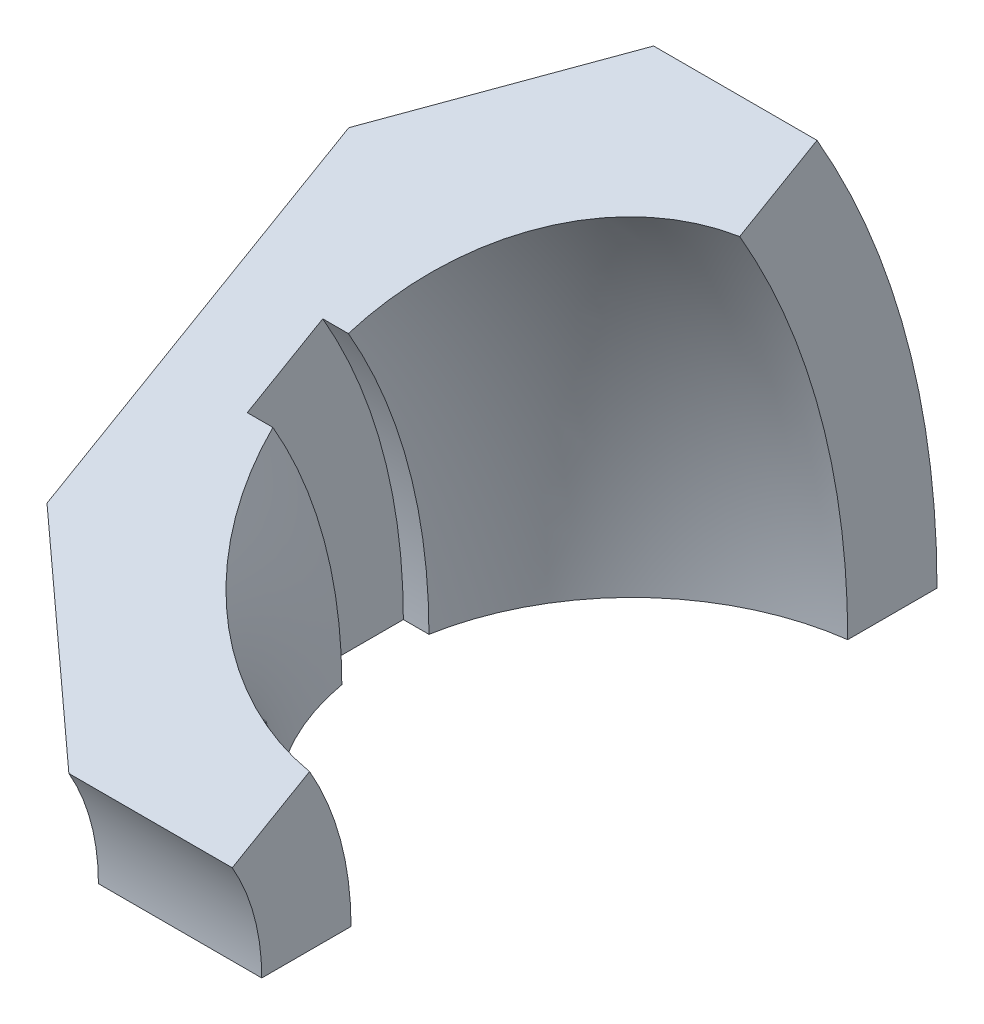
ISO-10303-21;
HEADER;
FILE_DESCRIPTION(('STEP AP214'),'2;1');
FILE_NAME('part.step','',(''),(''),'','','');
FILE_SCHEMA(('AUTOMOTIVE_DESIGN { 1 0 10303 214 1 1 1 1 }'));
ENDSEC;
DATA;
#1=APPLICATION_CONTEXT('core data for automotive mechanical design processes');
#2=APPLICATION_PROTOCOL_DEFINITION('international standard','automotive_design',2000,#1);
#3=PRODUCT_CONTEXT('',#1,'mechanical');
#4=PRODUCT('Part','Part','',(#3));
#5=PRODUCT_RELATED_PRODUCT_CATEGORY('part','',(#4));
#6=PRODUCT_DEFINITION_FORMATION('','',#4);
#7=PRODUCT_DEFINITION_CONTEXT('part definition',#1,'design');
#8=PRODUCT_DEFINITION('design','',#6,#7);
#9=PRODUCT_DEFINITION_SHAPE('','',#8);
#10=(LENGTH_UNIT() NAMED_UNIT(*) SI_UNIT(.MILLI.,.METRE.));
#11=(NAMED_UNIT(*) PLANE_ANGLE_UNIT() SI_UNIT($,.RADIAN.));
#12=(NAMED_UNIT(*) SI_UNIT($,.STERADIAN.) SOLID_ANGLE_UNIT());
#13=UNCERTAINTY_MEASURE_WITH_UNIT(LENGTH_MEASURE(1.E-05),#10,'distance_accuracy_value','');
#14=(GEOMETRIC_REPRESENTATION_CONTEXT(3) GLOBAL_UNCERTAINTY_ASSIGNED_CONTEXT((#13)) GLOBAL_UNIT_ASSIGNED_CONTEXT((#10,
#11,#12)) REPRESENTATION_CONTEXT('',''));
#15=CARTESIAN_POINT('',(0.,0.,0.));
#16=DIRECTION('',(0.,0.,1.));
#17=DIRECTION('',(1.,0.,0.));
#18=AXIS2_PLACEMENT_3D('',#15,#16,#17);
#19=CARTESIAN_POINT('',(0.,25.6217782649108,6.86533479473208));
#20=DIRECTION('',(0.,-0.866025403784447,-0.499999999999986));
#21=DIRECTION('',(0.,0.499999999999986,-0.866025403784447));
#22=AXIS2_PLACEMENT_3D('',#19,#20,#21);
#23=PLANE('',#22);
#24=DIRECTION('',(-1.,0.,0.));
#25=VECTOR('',#24,1.);
#26=CARTESIAN_POINT('',(-33.,10.1217782649112,33.71212231205));
#27=LINE('',#26,#25);
#28=CARTESIAN_POINT('',(-3.00000000000001,10.1217782649112,33.71212231205));
#29=VERTEX_POINT('',#28);
#30=CARTESIAN_POINT('',(-18.,10.1217782649112,33.71212231205));
#31=VERTEX_POINT('',#30);
#32=EDGE_CURVE('E189',#29,#31,#27,.T.);
#33=ORIENTED_EDGE('',*,*,#32,.F.);
#34=DIRECTION('',(0.,-0.499999999999986,0.866025403784447));
#35=VECTOR('',#34,1.);
#36=CARTESIAN_POINT('',(-3.00000000000001,10.1217782649112,33.71212231205));
#37=LINE('',#36,#35);
#38=CARTESIAN_POINT('',(-3.00000000000001,14.2200240139197,26.6137524528638));
#39=VERTEX_POINT('',#38);
#40=EDGE_CURVE('E181',#39,#29,#37,.T.);
#41=ORIENTED_EDGE('',*,*,#40,.F.);
#42=CARTESIAN_POINT('',(0.,25.6217782649108,6.86533479473208));
#43=DIRECTION('',(0.,0.866025403784447,0.499999999999986));
#44=DIRECTION('',(0.,0.499999999999986,-0.866025403784447));
#45=AXIS2_PLACEMENT_3D('',#42,#43,#44);
#46=CIRCLE('',#45,23.0000000000001);
#47=CARTESIAN_POINT('',(-22.6495033058122,23.6217782649108,10.3294364098699));
#48=VERTEX_POINT('',#47);
#49=EDGE_CURVE('E173',#48,#39,#46,.T.);
#50=ORIENTED_EDGE('',*,*,#49,.F.);
#51=DIRECTION('',(1.,0.,0.));
#52=VECTOR('',#51,1.);
#53=CARTESIAN_POINT('',(-22.6495033058122,23.6217782649108,10.3294364098699));
#54=LINE('',#53,#52);
#55=CARTESIAN_POINT('',(-25.,23.6217782649108,10.3294364098699));
#56=VERTEX_POINT('',#55);
#57=EDGE_CURVE('E165',#56,#48,#54,.T.);
#58=ORIENTED_EDGE('',*,*,#57,.F.);
#59=DIRECTION('',(0.,-0.499999999999986,0.866025403784447));
#60=VECTOR('',#59,1.);
#61=CARTESIAN_POINT('',(-25.,27.6217782649107,3.40123317959437));
#62=LINE('',#61,#60);
#63=CARTESIAN_POINT('',(-25.,27.6217782649107,3.40123317959437));
#64=VERTEX_POINT('',#63);
#65=EDGE_CURVE('E151',#64,#56,#62,.T.);
#66=ORIENTED_EDGE('',*,*,#65,.F.);
#67=DIRECTION('',(-1.,0.,0.));
#68=VECTOR('',#67,1.);
#69=CARTESIAN_POINT('',(-25.,27.6217782649107,3.40123317959437));
#70=LINE('',#69,#68);
#71=CARTESIAN_POINT('',(-22.6495033058122,27.6217782649107,3.40123317959437));
#72=VERTEX_POINT('',#71);
#73=EDGE_CURVE('E149',#72,#64,#70,.T.);
#74=ORIENTED_EDGE('',*,*,#73,.F.);
#75=CARTESIAN_POINT('',(0.,25.6217782649108,6.86533479473216));
#76=DIRECTION('',(0.,0.866025403784447,0.499999999999986));
#77=DIRECTION('',(0.,0.499999999999986,-0.866025403784447));
#78=AXIS2_PLACEMENT_3D('',#75,#76,#77);
#79=CIRCLE('',#78,23.);
#80=CARTESIAN_POINT('',(-3.00000000000001,37.0235325159018,-12.8830828633995));
#81=VERTEX_POINT('',#80);
#82=EDGE_CURVE('E130',#81,#72,#79,.T.);
#83=ORIENTED_EDGE('',*,*,#82,.F.);
#84=DIRECTION('',(0.,-0.499999999999986,0.866025403784447));
#85=VECTOR('',#84,1.);
#86=CARTESIAN_POINT('',(-3.00000000000001,37.0235325159018,-12.8830828633995));
#87=LINE('',#86,#85);
#88=CARTESIAN_POINT('',(-3.,41.1217782649103,-19.9814527225857));
#89=VERTEX_POINT('',#88);
#90=EDGE_CURVE('E137',#89,#81,#87,.T.);
#91=ORIENTED_EDGE('',*,*,#90,.F.);
#92=DIRECTION('',(1.,0.,0.));
#93=VECTOR('',#92,1.);
#94=CARTESIAN_POINT('',(-3.,41.1217782649103,-19.9814527225857));
#95=LINE('',#94,#93);
#96=CARTESIAN_POINT('',(-18.,41.1217782649103,-19.9814527225857));
#97=VERTEX_POINT('',#96);
#98=EDGE_CURVE('E144',#97,#89,#95,.T.);
#99=ORIENTED_EDGE('',*,*,#98,.F.);
#100=DIRECTION('',(-0.707106781186546,-0.353553390593265,0.612372435695802));
#101=VECTOR('',#100,1.);
#102=CARTESIAN_POINT('',(-100.243556529823,0.,51.2435565298233));
#103=LINE('',#102,#101);
#104=CARTESIAN_POINT('',(-33.,33.6217782649105,-6.99107166581893));
#105=VERTEX_POINT('',#104);
#106=EDGE_CURVE('E222',#105,#97,#103,.F.);
#107=ORIENTED_EDGE('',*,*,#106,.F.);
#108=DIRECTION('',(0.,0.499999999999986,-0.866025403784447));
#109=VECTOR('',#108,1.);
#110=CARTESIAN_POINT('',(-33.,41.1217782649103,-19.9814527225857));
#111=LINE('',#110,#109);
#112=CARTESIAN_POINT('',(-33.,17.621778264911,20.7217412552833));
#113=VERTEX_POINT('',#112);
#114=EDGE_CURVE('E197',#113,#105,#111,.T.);
#115=ORIENTED_EDGE('',*,*,#114,.F.);
#116=DIRECTION('',(-0.707106781186549,0.353553390593264,-0.612372435695799));
#117=VECTOR('',#116,1.);
#118=CARTESIAN_POINT('',(2.24355652982317,0.,51.2435565298233));
#119=LINE('',#118,#117);
#120=EDGE_CURVE('E45',#31,#113,#119,.T.);
#121=ORIENTED_EDGE('',*,*,#120,.F.);
#122=EDGE_LOOP('',(#33,#41,#50,#58,#66,#74,#83,#91,#99,#107,#115,#121));
#123=FACE_BOUND('',#122,.T.);
#124=ADVANCED_FACE('F37',(#123),#23,.F.);
#125=CARTESIAN_POINT('',(0.,0.,0.));
#126=DIRECTION('',(0.,-1.,0.));
#127=DIRECTION('',(0.,0.,-1.));
#128=AXIS2_PLACEMENT_3D('',#125,#126,#127);
#129=PLANE('',#128);
#130=DIRECTION('',(0.,0.,-1.));
#131=VECTOR('',#130,1.);
#132=CARTESIAN_POINT('',(-33.,0.,-31.));
#133=LINE('',#132,#131);
#134=CARTESIAN_POINT('',(-33.,0.,16.));
#135=VERTEX_POINT('',#134);
#136=CARTESIAN_POINT('',(-33.,0.,-15.9999999999999));
#137=VERTEX_POINT('',#136);
#138=EDGE_CURVE('E200',#135,#137,#133,.T.);
#139=ORIENTED_EDGE('',*,*,#138,.T.);
#140=DIRECTION('',(-0.707106781186546,0.,0.707106781186549));
#141=VECTOR('',#140,1.);
#142=CARTESIAN_POINT('',(-100.243556529823,0.,51.2435565298231));
#143=LINE('',#142,#141);
#144=CARTESIAN_POINT('',(-18.,0.,-31.));
#145=VERTEX_POINT('',#144);
#146=EDGE_CURVE('E216',#145,#137,#143,.T.);
#147=ORIENTED_EDGE('',*,*,#146,.F.);
#148=DIRECTION('',(1.,0.,0.));
#149=VECTOR('',#148,1.);
#150=CARTESIAN_POINT('',(-3.,0.,-31.));
#151=LINE('',#150,#149);
#152=CARTESIAN_POINT('',(-3.,0.,-31.));
#153=VERTEX_POINT('',#152);
#154=EDGE_CURVE('E205',#145,#153,#151,.T.);
#155=ORIENTED_EDGE('',*,*,#154,.T.);
#156=DIRECTION('',(0.,0.,1.));
#157=VECTOR('',#156,1.);
#158=CARTESIAN_POINT('',(-3.00000000000001,0.,-22.8035085019828));
#159=LINE('',#158,#157);
#160=CARTESIAN_POINT('',(-3.00000000000001,0.,-22.8035085019828));
#161=VERTEX_POINT('',#160);
#162=EDGE_CURVE('E209',#153,#161,#159,.T.);
#163=ORIENTED_EDGE('',*,*,#162,.T.);
#164=CARTESIAN_POINT('',(0.,0.,0.));
#165=DIRECTION('',(0.,1.,0.));
#166=DIRECTION('',(0.,0.,-1.));
#167=AXIS2_PLACEMENT_3D('',#164,#165,#166);
#168=CIRCLE('',#167,23.);
#169=CARTESIAN_POINT('',(-22.6495033058122,0.,-4.));
#170=VERTEX_POINT('',#169);
#171=EDGE_CURVE('E133',#161,#170,#168,.T.);
#172=ORIENTED_EDGE('',*,*,#171,.T.);
#173=DIRECTION('',(-1.,0.,0.));
#174=VECTOR('',#173,1.);
#175=CARTESIAN_POINT('',(-25.,0.,-4.));
#176=LINE('',#175,#174);
#177=CARTESIAN_POINT('',(-25.,0.,-4.));
#178=VERTEX_POINT('',#177);
#179=EDGE_CURVE('E156',#170,#178,#176,.T.);
#180=ORIENTED_EDGE('',*,*,#179,.T.);
#181=DIRECTION('',(0.,0.,1.));
#182=VECTOR('',#181,1.);
#183=CARTESIAN_POINT('',(-25.,0.,-4.));
#184=LINE('',#183,#182);
#185=CARTESIAN_POINT('',(-25.,0.,4.));
#186=VERTEX_POINT('',#185);
#187=EDGE_CURVE('E162',#178,#186,#184,.T.);
#188=ORIENTED_EDGE('',*,*,#187,.T.);
#189=DIRECTION('',(1.,0.,0.));
#190=VECTOR('',#189,1.);
#191=CARTESIAN_POINT('',(-22.6495033058122,0.,4.));
#192=LINE('',#191,#190);
#193=CARTESIAN_POINT('',(-22.6495033058122,0.,4.));
#194=VERTEX_POINT('',#193);
#195=EDGE_CURVE('E170',#186,#194,#192,.T.);
#196=ORIENTED_EDGE('',*,*,#195,.T.);
#197=CARTESIAN_POINT('',(0.,0.,0.));
#198=DIRECTION('',(0.,1.,0.));
#199=DIRECTION('',(0.,0.,-1.));
#200=AXIS2_PLACEMENT_3D('',#197,#198,#199);
#201=CIRCLE('',#200,23.0000000000001);
#202=CARTESIAN_POINT('',(-3.00000000000001,0.,22.8035085019828));
#203=VERTEX_POINT('',#202);
#204=EDGE_CURVE('E178',#194,#203,#201,.T.);
#205=ORIENTED_EDGE('',*,*,#204,.T.);
#206=DIRECTION('',(0.,0.,1.));
#207=VECTOR('',#206,1.);
#208=CARTESIAN_POINT('',(-3.00000000000001,0.,31.));
#209=LINE('',#208,#207);
#210=CARTESIAN_POINT('',(-3.00000000000001,0.,31.));
#211=VERTEX_POINT('',#210);
#212=EDGE_CURVE('E186',#203,#211,#209,.T.);
#213=ORIENTED_EDGE('',*,*,#212,.T.);
#214=DIRECTION('',(-1.,0.,0.));
#215=VECTOR('',#214,1.);
#216=CARTESIAN_POINT('',(-33.,0.,31.));
#217=LINE('',#216,#215);
#218=CARTESIAN_POINT('',(-18.,0.,31.));
#219=VERTEX_POINT('',#218);
#220=EDGE_CURVE('E194',#211,#219,#217,.T.);
#221=ORIENTED_EDGE('',*,*,#220,.T.);
#222=DIRECTION('',(-0.707106781186549,0.,-0.707106781186546));
#223=VECTOR('',#222,1.);
#224=CARTESIAN_POINT('',(2.24355652982317,0.,51.2435565298231));
#225=LINE('',#224,#223);
#226=EDGE_CURVE('E219',#135,#219,#225,.F.);
#227=ORIENTED_EDGE('',*,*,#226,.F.);
#228=EDGE_LOOP('',(#139,#147,#155,#163,#172,#180,#188,#196,#205,#213,#221,#227));
#229=FACE_BOUND('',#228,.T.);
#230=ADVANCED_FACE('F232',(#229),#129,.T.);
#231=CARTESIAN_POINT('',(0.,-4.5102810375397E-13,51.2435565298231));
#232=DIRECTION('',(1.,0.,0.));
#233=DIRECTION('',(0.,0.,1.));
#234=AXIS2_PLACEMENT_3D('',#231,#232,#233);
#235=TOROIDAL_SURFACE('',#234,51.2435565298231,23.);
#236=CARTESIAN_POINT('',(-22.6495033058122,-4.5102810375397E-13,51.2435565298231));
#237=DIRECTION('',(-1.,0.,0.));
#238=DIRECTION('',(0.,0.499999999999993,-0.866025403784442));
#239=AXIS2_PLACEMENT_3D('',#236,#237,#238);
#240=CIRCLE('',#239,55.2435565298231);
#241=EDGE_CURVE('E155',#72,#170,#240,.T.);
#242=ORIENTED_EDGE('',*,*,#241,.T.);
#243=ORIENTED_EDGE('',*,*,#171,.F.);
#244=CARTESIAN_POINT('',(-3.00000000000001,-4.5102810375397E-13,51.2435565298231));
#245=DIRECTION('',(-1.,0.,0.));
#246=DIRECTION('',(0.,0.499999999999992,-0.866025403784443));
#247=AXIS2_PLACEMENT_3D('',#244,#245,#246);
#248=CIRCLE('',#247,74.0470650318058);
#249=EDGE_CURVE('E126',#81,#161,#248,.T.);
#250=ORIENTED_EDGE('',*,*,#249,.F.);
#251=ORIENTED_EDGE('',*,*,#82,.T.);
#252=EDGE_LOOP('',(#242,#243,#250,#251));
#253=FACE_BOUND('',#252,.T.);
#254=ADVANCED_FACE('F128',(#253),#235,.F.);
#255=CARTESIAN_POINT('',(0.,-4.5102810375397E-13,51.2435565298231));
#256=DIRECTION('',(1.,0.,0.));
#257=DIRECTION('',(0.,0.,1.));
#258=AXIS2_PLACEMENT_3D('',#255,#256,#257);
#259=CYLINDRICAL_SURFACE('',#258,55.2435565298231);
#260=CARTESIAN_POINT('',(-25.,-4.5102810375397E-13,51.2435565298231));
#261=DIRECTION('',(-1.,0.,0.));
#262=DIRECTION('',(0.,0.499999999999993,-0.866025403784442));
#263=AXIS2_PLACEMENT_3D('',#260,#261,#262);
#264=CIRCLE('',#263,55.2435565298231);
#265=EDGE_CURVE('E160',#64,#178,#264,.T.);
#266=ORIENTED_EDGE('',*,*,#265,.T.);
#267=ORIENTED_EDGE('',*,*,#179,.F.);
#268=ORIENTED_EDGE('',*,*,#241,.F.);
#269=ORIENTED_EDGE('',*,*,#73,.T.);
#270=EDGE_LOOP('',(#266,#267,#268,#269));
#271=FACE_BOUND('',#270,.T.);
#272=ADVANCED_FACE('F253',(#271),#259,.F.);
#273=CARTESIAN_POINT('',(-25.,27.6217782649107,3.40123317959437));
#274=DIRECTION('',(-1.,0.,0.));
#275=DIRECTION('',(0.,0.,-1.));
#276=AXIS2_PLACEMENT_3D('',#273,#274,#275);
#277=PLANE('',#276);
#278=CARTESIAN_POINT('',(-25.,-4.5102810375397E-13,51.2435565298231));
#279=DIRECTION('',(-1.,0.,0.));
#280=DIRECTION('',(0.,0.499999999999995,-0.866025403784442));
#281=AXIS2_PLACEMENT_3D('',#278,#279,#280);
#282=CIRCLE('',#281,47.2435565298231);
#283=EDGE_CURVE('E168',#56,#186,#282,.T.);
#284=ORIENTED_EDGE('',*,*,#283,.T.);
#285=ORIENTED_EDGE('',*,*,#187,.F.);
#286=ORIENTED_EDGE('',*,*,#265,.F.);
#287=ORIENTED_EDGE('',*,*,#65,.T.);
#288=EDGE_LOOP('',(#284,#285,#286,#287));
#289=FACE_BOUND('',#288,.T.);
#290=ADVANCED_FACE('F249',(#289),#277,.F.);
#291=CARTESIAN_POINT('',(0.,-4.5102810375397E-13,51.2435565298231));
#292=DIRECTION('',(1.,0.,0.));
#293=DIRECTION('',(0.,0.,1.));
#294=AXIS2_PLACEMENT_3D('',#291,#292,#293);
#295=CYLINDRICAL_SURFACE('',#294,47.2435565298231);
#296=CARTESIAN_POINT('',(-22.6495033058122,-4.5102810375397E-13,51.2435565298231));
#297=DIRECTION('',(-1.,0.,0.));
#298=DIRECTION('',(0.,0.499999999999995,-0.866025403784442));
#299=AXIS2_PLACEMENT_3D('',#296,#297,#298);
#300=CIRCLE('',#299,47.2435565298231);
#301=EDGE_CURVE('E176',#48,#194,#300,.T.);
#302=ORIENTED_EDGE('',*,*,#301,.T.);
#303=ORIENTED_EDGE('',*,*,#195,.F.);
#304=ORIENTED_EDGE('',*,*,#283,.F.);
#305=ORIENTED_EDGE('',*,*,#57,.T.);
#306=EDGE_LOOP('',(#302,#303,#304,#305));
#307=FACE_BOUND('',#306,.T.);
#308=ADVANCED_FACE('F247',(#307),#295,.T.);
#309=CARTESIAN_POINT('',(0.,-4.5102810375397E-13,51.2435565298231));
#310=DIRECTION('',(1.,0.,0.));
#311=DIRECTION('',(0.,0.,1.));
#312=AXIS2_PLACEMENT_3D('',#309,#310,#311);
#313=TOROIDAL_SURFACE('',#312,51.2435565298231,23.0000000000001);
#314=CARTESIAN_POINT('',(-3.00000000000001,-4.5102810375397E-13,51.2435565298231));
#315=DIRECTION('',(-1.,0.,0.));
#316=DIRECTION('',(0.,0.5,-0.866025403784439));
#317=AXIS2_PLACEMENT_3D('',#314,#315,#316);
#318=CIRCLE('',#317,28.4400480278403);
#319=EDGE_CURVE('E184',#39,#203,#318,.T.);
#320=ORIENTED_EDGE('',*,*,#319,.T.);
#321=ORIENTED_EDGE('',*,*,#204,.F.);
#322=ORIENTED_EDGE('',*,*,#301,.F.);
#323=ORIENTED_EDGE('',*,*,#49,.T.);
#324=EDGE_LOOP('',(#320,#321,#322,#323));
#325=FACE_BOUND('',#324,.T.);
#326=ADVANCED_FACE('F244',(#325),#313,.F.);
#327=CARTESIAN_POINT('',(-3.00000000000001,10.1217782649112,33.71212231205));
#328=DIRECTION('',(-1.,0.,0.));
#329=DIRECTION('',(0.,0.,-1.));
#330=AXIS2_PLACEMENT_3D('',#327,#328,#329);
#331=PLANE('',#330);
#332=CARTESIAN_POINT('',(-3.00000000000001,-4.5102810375397E-13,51.2435565298231));
#333=DIRECTION('',(-1.,0.,0.));
#334=DIRECTION('',(0.,0.500000000000006,-0.866025403784435));
#335=AXIS2_PLACEMENT_3D('',#332,#333,#334);
#336=CIRCLE('',#335,20.2435565298231);
#337=EDGE_CURVE('E192',#29,#211,#336,.T.);
#338=ORIENTED_EDGE('',*,*,#337,.T.);
#339=ORIENTED_EDGE('',*,*,#212,.F.);
#340=ORIENTED_EDGE('',*,*,#319,.F.);
#341=ORIENTED_EDGE('',*,*,#40,.T.);
#342=EDGE_LOOP('',(#338,#339,#340,#341));
#343=FACE_BOUND('',#342,.T.);
#344=ADVANCED_FACE('F241',(#343),#331,.F.);
#345=CARTESIAN_POINT('',(0.,-4.5102810375397E-13,51.2435565298231));
#346=DIRECTION('',(1.,0.,0.));
#347=DIRECTION('',(0.,0.,1.));
#348=AXIS2_PLACEMENT_3D('',#345,#346,#347);
#349=CYLINDRICAL_SURFACE('',#348,20.2435565298231);
#350=ORIENTED_EDGE('',*,*,#220,.F.);
#351=ORIENTED_EDGE('',*,*,#337,.F.);
#352=ORIENTED_EDGE('',*,*,#32,.T.);
#353=CARTESIAN_POINT('',(-18.,-4.5102810375397E-13,51.2435565298231));
#354=DIRECTION('',(-1.,0.,0.));
#355=DIRECTION('',(0.,0.,1.));
#356=AXIS2_PLACEMENT_3D('',#353,#354,#355);
#357=CIRCLE('',#356,20.2435565298231);
#358=EDGE_CURVE('E58',#219,#31,#357,.F.);
#359=ORIENTED_EDGE('',*,*,#358,.F.);
#360=EDGE_LOOP('',(#350,#351,#352,#359));
#361=FACE_BOUND('',#360,.T.);
#362=ADVANCED_FACE('F236',(#361),#349,.F.);
#363=CARTESIAN_POINT('',(-33.,41.1217782649103,-19.9814527225857));
#364=DIRECTION('',(1.,0.,0.));
#365=DIRECTION('',(0.,0.,1.));
#366=AXIS2_PLACEMENT_3D('',#363,#364,#365);
#367=PLANE('',#366);
#368=ORIENTED_EDGE('',*,*,#114,.T.);
#369=CARTESIAN_POINT('',(-33.,-4.5102810375397E-13,51.2435565298231));
#370=DIRECTION('',(-1.,0.,0.));
#371=DIRECTION('',(0.,0.,1.));
#372=AXIS2_PLACEMENT_3D('',#369,#370,#371);
#373=CIRCLE('',#372,67.243556529823);
#374=EDGE_CURVE('E212',#137,#105,#373,.F.);
#375=ORIENTED_EDGE('',*,*,#374,.F.);
#376=ORIENTED_EDGE('',*,*,#138,.F.);
#377=CARTESIAN_POINT('',(-33.,-4.5102810375397E-13,51.2435565298231));
#378=DIRECTION('',(-1.,0.,0.));
#379=DIRECTION('',(0.,0.,1.));
#380=AXIS2_PLACEMENT_3D('',#377,#378,#379);
#381=CIRCLE('',#380,35.2435565298231);
#382=EDGE_CURVE('E214',#113,#135,#381,.T.);
#383=ORIENTED_EDGE('',*,*,#382,.F.);
#384=EDGE_LOOP('',(#368,#375,#376,#383));
#385=FACE_BOUND('',#384,.T.);
#386=ADVANCED_FACE('F228',(#385),#367,.F.);
#387=CARTESIAN_POINT('',(0.,-4.5102810375397E-13,51.2435565298231));
#388=DIRECTION('',(1.,0.,0.));
#389=DIRECTION('',(0.,0.,1.));
#390=AXIS2_PLACEMENT_3D('',#387,#388,#389);
#391=CYLINDRICAL_SURFACE('',#390,82.2435565298231);
#392=ORIENTED_EDGE('',*,*,#98,.T.);
#393=CARTESIAN_POINT('',(-3.,-4.5102810375397E-13,51.2435565298231));
#394=DIRECTION('',(-1.,0.,0.));
#395=DIRECTION('',(0.,0.499999999999991,-0.866025403784444));
#396=AXIS2_PLACEMENT_3D('',#393,#394,#395);
#397=CIRCLE('',#396,82.2435565298231);
#398=EDGE_CURVE('E141',#89,#153,#397,.T.);
#399=ORIENTED_EDGE('',*,*,#398,.T.);
#400=ORIENTED_EDGE('',*,*,#154,.F.);
#401=CARTESIAN_POINT('',(-18.,-4.5102810375397E-13,51.2435565298231));
#402=DIRECTION('',(-1.,0.,0.));
#403=DIRECTION('',(0.,0.,1.));
#404=AXIS2_PLACEMENT_3D('',#401,#402,#403);
#405=CIRCLE('',#404,82.2435565298231);
#406=EDGE_CURVE('E11',#97,#145,#405,.T.);
#407=ORIENTED_EDGE('',*,*,#406,.F.);
#408=EDGE_LOOP('',(#392,#399,#400,#407));
#409=FACE_BOUND('',#408,.T.);
#410=ADVANCED_FACE('F254',(#409),#391,.T.);
#411=CARTESIAN_POINT('',(-3.,37.0235325159018,-12.8830828633995));
#412=DIRECTION('',(-1.,0.,0.));
#413=DIRECTION('',(0.,0.,-1.));
#414=AXIS2_PLACEMENT_3D('',#411,#412,#413);
#415=PLANE('',#414);
#416=ORIENTED_EDGE('',*,*,#162,.F.);
#417=ORIENTED_EDGE('',*,*,#398,.F.);
#418=ORIENTED_EDGE('',*,*,#90,.T.);
#419=ORIENTED_EDGE('',*,*,#249,.T.);
#420=EDGE_LOOP('',(#416,#417,#418,#419));
#421=FACE_BOUND('',#420,.T.);
#422=ADVANCED_FACE('F140',(#421),#415,.F.);
#423=CARTESIAN_POINT('',(-33.,-4.5102810375397E-13,51.2435565298231));
#424=DIRECTION('',(-1.,0.,0.));
#425=DIRECTION('',(0.,0.,-1.));
#426=AXIS2_PLACEMENT_3D('',#423,#424,#425);
#427=CONICAL_SURFACE('',#426,35.2435565298231,0.785398163397447);
#428=ORIENTED_EDGE('',*,*,#120,.T.);
#429=ORIENTED_EDGE('',*,*,#382,.T.);
#430=ORIENTED_EDGE('',*,*,#226,.T.);
#431=ORIENTED_EDGE('',*,*,#358,.T.);
#432=EDGE_LOOP('',(#428,#429,#430,#431));
#433=FACE_BOUND('',#432,.T.);
#434=ADVANCED_FACE('F224',(#433),#427,.F.);
#435=CARTESIAN_POINT('',(-18.,-4.5102810375397E-13,51.2435565298231));
#436=DIRECTION('',(1.,0.,0.));
#437=DIRECTION('',(0.,0.,1.));
#438=AXIS2_PLACEMENT_3D('',#435,#436,#437);
#439=CONICAL_SURFACE('',#438,82.2435565298231,0.78539816339745);
#440=ORIENTED_EDGE('',*,*,#106,.T.);
#441=ORIENTED_EDGE('',*,*,#406,.T.);
#442=ORIENTED_EDGE('',*,*,#146,.T.);
#443=ORIENTED_EDGE('',*,*,#374,.T.);
#444=EDGE_LOOP('',(#440,#441,#442,#443));
#445=FACE_BOUND('',#444,.T.);
#446=ADVANCED_FACE('F39',(#445),#439,.T.);
#447=CLOSED_SHELL('',(#124,#230,#254,#272,#290,#308,#326,#344,#362,#386,#410,#422,#434,#446));
#448=MANIFOLD_SOLID_BREP('B2',#447);
#449=ADVANCED_BREP_SHAPE_REPRESENTATION('',(#18,#448),#14);
#450=SHAPE_DEFINITION_REPRESENTATION(#9,#449);
ENDSEC;
END-ISO-10303-21;
